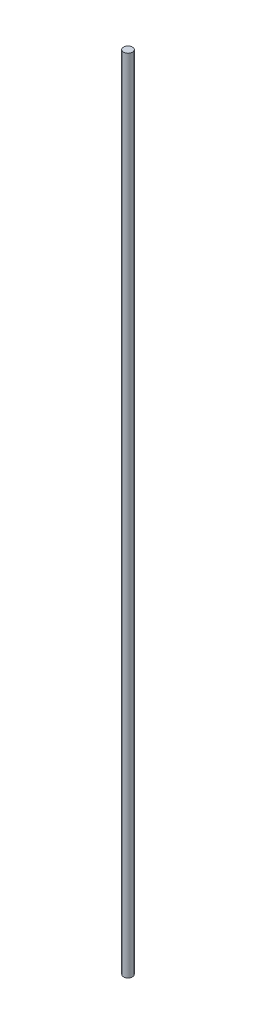
ISO-10303-21;
HEADER;
FILE_DESCRIPTION(('STEP AP214'),'2;1');
FILE_NAME('part.step','',(''),(''),'','','');
FILE_SCHEMA(('AUTOMOTIVE_DESIGN { 1 0 10303 214 1 1 1 1 }'));
ENDSEC;
DATA;
#1=APPLICATION_CONTEXT('core data for automotive mechanical design processes');
#2=APPLICATION_PROTOCOL_DEFINITION('international standard','automotive_design',2000,#1);
#3=PRODUCT_CONTEXT('',#1,'mechanical');
#4=PRODUCT('Part','Part','',(#3));
#5=PRODUCT_RELATED_PRODUCT_CATEGORY('part','',(#4));
#6=PRODUCT_DEFINITION_FORMATION('','',#4);
#7=PRODUCT_DEFINITION_CONTEXT('part definition',#1,'design');
#8=PRODUCT_DEFINITION('design','',#6,#7);
#9=PRODUCT_DEFINITION_SHAPE('','',#8);
#10=(LENGTH_UNIT() NAMED_UNIT(*) SI_UNIT(.MILLI.,.METRE.));
#11=(NAMED_UNIT(*) PLANE_ANGLE_UNIT() SI_UNIT($,.RADIAN.));
#12=(NAMED_UNIT(*) SI_UNIT($,.STERADIAN.) SOLID_ANGLE_UNIT());
#13=UNCERTAINTY_MEASURE_WITH_UNIT(LENGTH_MEASURE(1.E-05),#10,'distance_accuracy_value','');
#14=(GEOMETRIC_REPRESENTATION_CONTEXT(3) GLOBAL_UNCERTAINTY_ASSIGNED_CONTEXT((#13)) GLOBAL_UNIT_ASSIGNED_CONTEXT((#10,
#11,#12)) REPRESENTATION_CONTEXT('',''));
#15=CARTESIAN_POINT('',(0.,0.,0.));
#16=DIRECTION('',(0.,0.,1.));
#17=DIRECTION('',(1.,0.,0.));
#18=AXIS2_PLACEMENT_3D('',#15,#16,#17);
#19=CARTESIAN_POINT('',(0.,685.8,0.));
#20=DIRECTION('',(0.,-1.,0.));
#21=DIRECTION('',(0.,0.,-1.));
#22=AXIS2_PLACEMENT_3D('',#19,#20,#21);
#23=CYLINDRICAL_SURFACE('',#22,6.35);
#24=CARTESIAN_POINT('',(0.,685.8,0.));
#25=DIRECTION('',(0.,1.,0.));
#26=DIRECTION('',(0.,0.,1.));
#27=AXIS2_PLACEMENT_3D('',#24,#25,#26);
#28=CIRCLE('',#27,6.35);
#29=CARTESIAN_POINT('',(0.,685.8,6.35));
#30=VERTEX_POINT('',#29);
#31=EDGE_CURVE('E10',#30,#30,#28,.T.);
#32=ORIENTED_EDGE('',*,*,#31,.F.);
#33=EDGE_LOOP('',(#32));
#34=FACE_BOUND('',#33,.T.);
#35=CARTESIAN_POINT('',(0.,-457.2,0.));
#36=DIRECTION('',(0.,1.,0.));
#37=DIRECTION('',(0.,0.,1.));
#38=AXIS2_PLACEMENT_3D('',#35,#36,#37);
#39=CIRCLE('',#38,6.35);
#40=CARTESIAN_POINT('',(0.,-457.2,6.35));
#41=VERTEX_POINT('',#40);
#42=EDGE_CURVE('E37',#41,#41,#39,.T.);
#43=ORIENTED_EDGE('',*,*,#42,.T.);
#44=EDGE_LOOP('',(#43));
#45=FACE_BOUND('',#44,.T.);
#46=ADVANCED_FACE('F31',(#34,#45),#23,.T.);
#47=CARTESIAN_POINT('',(0.,685.8,0.));
#48=DIRECTION('',(0.,1.,0.));
#49=DIRECTION('',(0.,0.,1.));
#50=AXIS2_PLACEMENT_3D('',#47,#48,#49);
#51=PLANE('',#50);
#52=ORIENTED_EDGE('',*,*,#31,.T.);
#53=EDGE_LOOP('',(#52));
#54=FACE_BOUND('',#53,.T.);
#55=ADVANCED_FACE('F46',(#54),#51,.T.);
#56=CARTESIAN_POINT('',(0.,-457.2,0.));
#57=DIRECTION('',(0.,1.,0.));
#58=DIRECTION('',(0.,0.,1.));
#59=AXIS2_PLACEMENT_3D('',#56,#57,#58);
#60=PLANE('',#59);
#61=ORIENTED_EDGE('',*,*,#42,.F.);
#62=EDGE_LOOP('',(#61));
#63=FACE_BOUND('',#62,.T.);
#64=ADVANCED_FACE('F44',(#63),#60,.F.);
#65=CLOSED_SHELL('',(#46,#55,#64));
#66=MANIFOLD_SOLID_BREP('B2',#65);
#67=ADVANCED_BREP_SHAPE_REPRESENTATION('',(#18,#66),#14);
#68=SHAPE_DEFINITION_REPRESENTATION(#9,#67);
ENDSEC;
END-ISO-10303-21;
